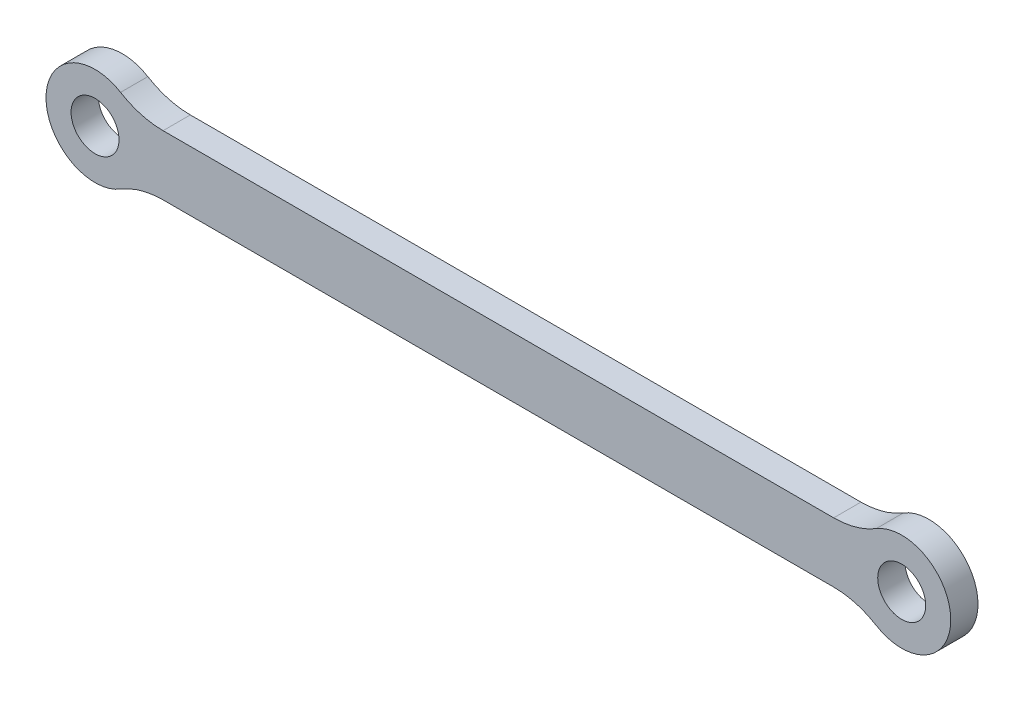
ISO-10303-21;
HEADER;
FILE_DESCRIPTION(('STEP AP214'),'2;1');
FILE_NAME('part.step','',(''),(''),'','','');
FILE_SCHEMA(('AUTOMOTIVE_DESIGN { 1 0 10303 214 1 1 1 1 }'));
ENDSEC;
DATA;
#1=APPLICATION_CONTEXT('core data for automotive mechanical design processes');
#2=APPLICATION_PROTOCOL_DEFINITION('international standard','automotive_design',2000,#1);
#3=PRODUCT_CONTEXT('',#1,'mechanical');
#4=PRODUCT('Part','Part','',(#3));
#5=PRODUCT_RELATED_PRODUCT_CATEGORY('part','',(#4));
#6=PRODUCT_DEFINITION_FORMATION('','',#4);
#7=PRODUCT_DEFINITION_CONTEXT('part definition',#1,'design');
#8=PRODUCT_DEFINITION('design','',#6,#7);
#9=PRODUCT_DEFINITION_SHAPE('','',#8);
#10=(LENGTH_UNIT() NAMED_UNIT(*) SI_UNIT(.MILLI.,.METRE.));
#11=(NAMED_UNIT(*) PLANE_ANGLE_UNIT() SI_UNIT($,.RADIAN.));
#12=(NAMED_UNIT(*) SI_UNIT($,.STERADIAN.) SOLID_ANGLE_UNIT());
#13=UNCERTAINTY_MEASURE_WITH_UNIT(LENGTH_MEASURE(1.E-05),#10,'distance_accuracy_value','');
#14=(GEOMETRIC_REPRESENTATION_CONTEXT(3) GLOBAL_UNCERTAINTY_ASSIGNED_CONTEXT((#13)) GLOBAL_UNIT_ASSIGNED_CONTEXT((#10,
#11,#12)) REPRESENTATION_CONTEXT('',''));
#15=CARTESIAN_POINT('',(0.,0.,0.));
#16=DIRECTION('',(0.,0.,1.));
#17=DIRECTION('',(1.,0.,0.));
#18=AXIS2_PLACEMENT_3D('',#15,#16,#17);
#19=CARTESIAN_POINT('',(-148.,0.,0.));
#20=DIRECTION('',(0.,0.,1.));
#21=DIRECTION('',(1.,0.,0.));
#22=AXIS2_PLACEMENT_3D('',#19,#20,#21);
#23=PLANE('',#22);
#24=CARTESIAN_POINT('',(0.,0.,0.));
#25=DIRECTION('',(0.,0.,-1.));
#26=DIRECTION('',(-1.,0.,0.));
#27=AXIS2_PLACEMENT_3D('',#24,#25,#26);
#28=CIRCLE('',#27,4.4);
#29=CARTESIAN_POINT('',(-4.4,0.,0.));
#30=VERTEX_POINT('',#29);
#31=EDGE_CURVE('E130',#30,#30,#28,.F.);
#32=ORIENTED_EDGE('',*,*,#31,.T.);
#33=EDGE_LOOP('',(#32));
#34=FACE_BOUND('',#33,.T.);
#35=CARTESIAN_POINT('',(-135.520016025651,20.5,0.));
#36=DIRECTION('',(0.,0.,-1.));
#37=DIRECTION('',(-1.,0.,0.));
#38=AXIS2_PLACEMENT_3D('',#35,#36,#37);
#39=CIRCLE('',#38,15.);
#40=CARTESIAN_POINT('',(-143.320006009619,7.68749999999998,0.));
#41=VERTEX_POINT('',#40);
#42=CARTESIAN_POINT('',(-135.520016025651,5.49999999999997,0.));
#43=VERTEX_POINT('',#42);
#44=EDGE_CURVE('E81',#41,#43,#39,.F.);
#45=ORIENTED_EDGE('',*,*,#44,.T.);
#46=DIRECTION('',(1.,0.,0.));
#47=VECTOR('',#46,1.);
#48=CARTESIAN_POINT('',(-140.876096575612,5.49999999999998,0.));
#49=LINE('',#48,#47);
#50=CARTESIAN_POINT('',(-12.4799839743487,5.49999999999998,0.));
#51=VERTEX_POINT('',#50);
#52=EDGE_CURVE('E84',#43,#51,#49,.T.);
#53=ORIENTED_EDGE('',*,*,#52,.T.);
#54=CARTESIAN_POINT('',(-12.4799839743487,20.5,0.));
#55=DIRECTION('',(0.,0.,-1.));
#56=DIRECTION('',(-1.,0.,0.));
#57=AXIS2_PLACEMENT_3D('',#54,#55,#56);
#58=CIRCLE('',#57,15.);
#59=CARTESIAN_POINT('',(-4.67999399038076,7.68749999999999,0.));
#60=VERTEX_POINT('',#59);
#61=EDGE_CURVE('E133',#51,#60,#58,.F.);
#62=ORIENTED_EDGE('',*,*,#61,.T.);
#63=CARTESIAN_POINT('',(0.,0.,0.));
#64=DIRECTION('',(0.,0.,-1.));
#65=DIRECTION('',(-1.,0.,0.));
#66=AXIS2_PLACEMENT_3D('',#63,#64,#65);
#67=CIRCLE('',#66,9.);
#68=CARTESIAN_POINT('',(-4.67999399038075,-7.68750000000001,0.));
#69=VERTEX_POINT('',#68);
#70=EDGE_CURVE('E135',#69,#60,#67,.F.);
#71=ORIENTED_EDGE('',*,*,#70,.F.);
#72=CARTESIAN_POINT('',(-12.4799839743487,-20.5,0.));
#73=DIRECTION('',(0.,0.,-1.));
#74=DIRECTION('',(-1.,0.,0.));
#75=AXIS2_PLACEMENT_3D('',#72,#73,#74);
#76=CIRCLE('',#75,15.);
#77=CARTESIAN_POINT('',(-12.4799839743487,-5.50000000000002,0.));
#78=VERTEX_POINT('',#77);
#79=EDGE_CURVE('E138',#69,#78,#76,.F.);
#80=ORIENTED_EDGE('',*,*,#79,.T.);
#81=DIRECTION('',(1.,0.,0.));
#82=VECTOR('',#81,1.);
#83=CARTESIAN_POINT('',(-140.876096575612,-5.50000000000002,0.));
#84=LINE('',#83,#82);
#85=CARTESIAN_POINT('',(-135.520016025651,-5.50000000000002,0.));
#86=VERTEX_POINT('',#85);
#87=EDGE_CURVE('E107',#78,#86,#84,.F.);
#88=ORIENTED_EDGE('',*,*,#87,.T.);
#89=CARTESIAN_POINT('',(-135.520016025651,-20.5,0.));
#90=DIRECTION('',(0.,0.,-1.));
#91=DIRECTION('',(-1.,0.,0.));
#92=AXIS2_PLACEMENT_3D('',#89,#90,#91);
#93=CIRCLE('',#92,15.);
#94=CARTESIAN_POINT('',(-143.320006009619,-7.68750000000003,0.));
#95=VERTEX_POINT('',#94);
#96=EDGE_CURVE('E141',#86,#95,#93,.F.);
#97=ORIENTED_EDGE('',*,*,#96,.T.);
#98=CARTESIAN_POINT('',(-148.,0.,0.));
#99=DIRECTION('',(0.,0.,-1.));
#100=DIRECTION('',(-1.,0.,0.));
#101=AXIS2_PLACEMENT_3D('',#98,#99,#100);
#102=CIRCLE('',#101,9.00000000000001);
#103=EDGE_CURVE('E79',#41,#95,#102,.F.);
#104=ORIENTED_EDGE('',*,*,#103,.F.);
#105=EDGE_LOOP('',(#45,#53,#62,#71,#80,#88,#97,#104));
#106=FACE_BOUND('',#105,.T.);
#107=CARTESIAN_POINT('',(-148.,0.,0.));
#108=DIRECTION('',(0.,0.,-1.));
#109=DIRECTION('',(-1.,0.,0.));
#110=AXIS2_PLACEMENT_3D('',#107,#108,#109);
#111=CIRCLE('',#110,4.39999999999999);
#112=CARTESIAN_POINT('',(-152.4,0.,0.));
#113=VERTEX_POINT('',#112);
#114=EDGE_CURVE('E20',#113,#113,#111,.F.);
#115=ORIENTED_EDGE('',*,*,#114,.T.);
#116=EDGE_LOOP('',(#115));
#117=FACE_BOUND('',#116,.T.);
#118=ADVANCED_FACE('F17',(#34,#106,#117),#23,.F.);
#119=CARTESIAN_POINT('',(-148.,0.,5.));
#120=DIRECTION('',(0.,0.,-1.));
#121=DIRECTION('',(-1.,0.,0.));
#122=AXIS2_PLACEMENT_3D('',#119,#120,#121);
#123=CYLINDRICAL_SURFACE('',#122,4.39999999999999);
#124=CARTESIAN_POINT('',(-148.,0.,5.));
#125=DIRECTION('',(0.,0.,-1.));
#126=DIRECTION('',(-1.,0.,0.));
#127=AXIS2_PLACEMENT_3D('',#124,#125,#126);
#128=CIRCLE('',#127,4.39999999999999);
#129=CARTESIAN_POINT('',(-152.4,0.,5.));
#130=VERTEX_POINT('',#129);
#131=EDGE_CURVE('E127',#130,#130,#128,.T.);
#132=ORIENTED_EDGE('',*,*,#131,.F.);
#133=EDGE_LOOP('',(#132));
#134=FACE_BOUND('',#133,.T.);
#135=ORIENTED_EDGE('',*,*,#114,.F.);
#136=EDGE_LOOP('',(#135));
#137=FACE_BOUND('',#136,.T.);
#138=ADVANCED_FACE('F198',(#134,#137),#123,.F.);
#139=CARTESIAN_POINT('',(-140.876096575612,5.49999999999998,5.));
#140=DIRECTION('',(0.,-1.,0.));
#141=DIRECTION('',(0.,0.,-1.));
#142=AXIS2_PLACEMENT_3D('',#139,#140,#141);
#143=PLANE('',#142);
#144=DIRECTION('',(0.,0.,-1.));
#145=VECTOR('',#144,1.);
#146=CARTESIAN_POINT('',(-135.520016025651,5.49999999999997,5.));
#147=LINE('',#146,#145);
#148=CARTESIAN_POINT('',(-135.520016025651,5.49999999999997,5.));
#149=VERTEX_POINT('',#148);
#150=EDGE_CURVE('E89',#43,#149,#147,.F.);
#151=ORIENTED_EDGE('',*,*,#150,.T.);
#152=DIRECTION('',(1.,0.,0.));
#153=VECTOR('',#152,1.);
#154=CARTESIAN_POINT('',(-148.,5.49999999999998,5.));
#155=LINE('',#154,#153);
#156=CARTESIAN_POINT('',(-12.4799839743487,5.49999999999998,5.));
#157=VERTEX_POINT('',#156);
#158=EDGE_CURVE('E126',#157,#149,#155,.F.);
#159=ORIENTED_EDGE('',*,*,#158,.F.);
#160=DIRECTION('',(0.,0.,-1.));
#161=VECTOR('',#160,1.);
#162=CARTESIAN_POINT('',(-12.4799839743487,5.49999999999998,5.));
#163=LINE('',#162,#161);
#164=EDGE_CURVE('E95',#157,#51,#163,.T.);
#165=ORIENTED_EDGE('',*,*,#164,.T.);
#166=ORIENTED_EDGE('',*,*,#52,.F.);
#167=EDGE_LOOP('',(#151,#159,#165,#166));
#168=FACE_BOUND('',#167,.T.);
#169=ADVANCED_FACE('F91',(#168),#143,.F.);
#170=CARTESIAN_POINT('',(-135.520016025651,20.5,5.));
#171=DIRECTION('',(0.,0.,-1.));
#172=DIRECTION('',(-1.,0.,0.));
#173=AXIS2_PLACEMENT_3D('',#170,#171,#172);
#174=CYLINDRICAL_SURFACE('',#173,15.);
#175=ORIENTED_EDGE('',*,*,#150,.F.);
#176=ORIENTED_EDGE('',*,*,#44,.F.);
#177=DIRECTION('',(0.,0.,-1.));
#178=VECTOR('',#177,1.);
#179=CARTESIAN_POINT('',(-143.320006009619,7.68749999999998,5.));
#180=LINE('',#179,#178);
#181=CARTESIAN_POINT('',(-143.320006009619,7.68749999999998,5.));
#182=VERTEX_POINT('',#181);
#183=EDGE_CURVE('E102',#182,#41,#180,.T.);
#184=ORIENTED_EDGE('',*,*,#183,.F.);
#185=CARTESIAN_POINT('',(-135.520016025651,20.5,5.));
#186=DIRECTION('',(0.,0.,-1.));
#187=DIRECTION('',(-1.,0.,0.));
#188=AXIS2_PLACEMENT_3D('',#185,#186,#187);
#189=CIRCLE('',#188,15.);
#190=EDGE_CURVE('E100',#149,#182,#189,.T.);
#191=ORIENTED_EDGE('',*,*,#190,.F.);
#192=EDGE_LOOP('',(#175,#176,#184,#191));
#193=FACE_BOUND('',#192,.T.);
#194=ADVANCED_FACE('F98',(#193),#174,.F.);
#195=CARTESIAN_POINT('',(-148.,0.,5.));
#196=DIRECTION('',(0.,0.,-1.));
#197=DIRECTION('',(-1.,0.,0.));
#198=AXIS2_PLACEMENT_3D('',#195,#196,#197);
#199=CYLINDRICAL_SURFACE('',#198,9.00000000000001);
#200=ORIENTED_EDGE('',*,*,#103,.T.);
#201=DIRECTION('',(0.,0.,-1.));
#202=VECTOR('',#201,1.);
#203=CARTESIAN_POINT('',(-143.320006009619,-7.68750000000003,5.));
#204=LINE('',#203,#202);
#205=CARTESIAN_POINT('',(-143.320006009619,-7.68750000000003,5.));
#206=VERTEX_POINT('',#205);
#207=EDGE_CURVE('E109',#95,#206,#204,.F.);
#208=ORIENTED_EDGE('',*,*,#207,.T.);
#209=CARTESIAN_POINT('',(-148.,0.,5.));
#210=DIRECTION('',(0.,0.,-1.));
#211=DIRECTION('',(-1.,0.,0.));
#212=AXIS2_PLACEMENT_3D('',#209,#210,#211);
#213=CIRCLE('',#212,9.00000000000001);
#214=EDGE_CURVE('E123',#182,#206,#213,.F.);
#215=ORIENTED_EDGE('',*,*,#214,.F.);
#216=ORIENTED_EDGE('',*,*,#183,.T.);
#217=EDGE_LOOP('',(#200,#208,#215,#216));
#218=FACE_BOUND('',#217,.T.);
#219=ADVANCED_FACE('F146',(#218),#199,.T.);
#220=CARTESIAN_POINT('',(-135.520016025651,-20.5,5.));
#221=DIRECTION('',(0.,0.,-1.));
#222=DIRECTION('',(-1.,0.,0.));
#223=AXIS2_PLACEMENT_3D('',#220,#221,#222);
#224=CYLINDRICAL_SURFACE('',#223,15.);
#225=ORIENTED_EDGE('',*,*,#207,.F.);
#226=ORIENTED_EDGE('',*,*,#96,.F.);
#227=DIRECTION('',(0.,0.,1.));
#228=VECTOR('',#227,1.);
#229=CARTESIAN_POINT('',(-135.520016025651,-5.50000000000002,5.));
#230=LINE('',#229,#228);
#231=CARTESIAN_POINT('',(-135.520016025651,-5.50000000000002,5.));
#232=VERTEX_POINT('',#231);
#233=EDGE_CURVE('E108',#86,#232,#230,.T.);
#234=ORIENTED_EDGE('',*,*,#233,.T.);
#235=CARTESIAN_POINT('',(-135.520016025651,-20.5,5.));
#236=DIRECTION('',(0.,0.,-1.));
#237=DIRECTION('',(-1.,0.,0.));
#238=AXIS2_PLACEMENT_3D('',#235,#236,#237);
#239=CIRCLE('',#238,15.);
#240=EDGE_CURVE('E120',#206,#232,#239,.T.);
#241=ORIENTED_EDGE('',*,*,#240,.F.);
#242=EDGE_LOOP('',(#225,#226,#234,#241));
#243=FACE_BOUND('',#242,.T.);
#244=ADVANCED_FACE('F151',(#243),#224,.F.);
#245=CARTESIAN_POINT('',(-140.876096575612,-5.50000000000002,5.));
#246=DIRECTION('',(0.,1.,0.));
#247=DIRECTION('',(0.,0.,1.));
#248=AXIS2_PLACEMENT_3D('',#245,#246,#247);
#249=PLANE('',#248);
#250=ORIENTED_EDGE('',*,*,#233,.F.);
#251=ORIENTED_EDGE('',*,*,#87,.F.);
#252=DIRECTION('',(0.,0.,-1.));
#253=VECTOR('',#252,1.);
#254=CARTESIAN_POINT('',(-12.4799839743487,-5.50000000000002,5.));
#255=LINE('',#254,#253);
#256=CARTESIAN_POINT('',(-12.4799839743487,-5.50000000000002,5.));
#257=VERTEX_POINT('',#256);
#258=EDGE_CURVE('E140',#78,#257,#255,.F.);
#259=ORIENTED_EDGE('',*,*,#258,.T.);
#260=DIRECTION('',(1.,0.,0.));
#261=VECTOR('',#260,1.);
#262=CARTESIAN_POINT('',(-148.,-5.50000000000002,5.));
#263=LINE('',#262,#261);
#264=EDGE_CURVE('E119',#232,#257,#263,.T.);
#265=ORIENTED_EDGE('',*,*,#264,.F.);
#266=EDGE_LOOP('',(#250,#251,#259,#265));
#267=FACE_BOUND('',#266,.T.);
#268=ADVANCED_FACE('F168',(#267),#249,.F.);
#269=CARTESIAN_POINT('',(-12.4799839743487,-20.5,5.));
#270=DIRECTION('',(0.,0.,-1.));
#271=DIRECTION('',(-1.,0.,0.));
#272=AXIS2_PLACEMENT_3D('',#269,#270,#271);
#273=CYLINDRICAL_SURFACE('',#272,15.);
#274=ORIENTED_EDGE('',*,*,#258,.F.);
#275=ORIENTED_EDGE('',*,*,#79,.F.);
#276=DIRECTION('',(0.,0.,-1.));
#277=VECTOR('',#276,1.);
#278=CARTESIAN_POINT('',(-4.67999399038075,-7.68750000000001,5.));
#279=LINE('',#278,#277);
#280=CARTESIAN_POINT('',(-4.67999399038075,-7.68750000000001,5.));
#281=VERTEX_POINT('',#280);
#282=EDGE_CURVE('E137',#281,#69,#279,.T.);
#283=ORIENTED_EDGE('',*,*,#282,.F.);
#284=CARTESIAN_POINT('',(-12.4799839743487,-20.5,5.));
#285=DIRECTION('',(0.,0.,-1.));
#286=DIRECTION('',(-1.,0.,0.));
#287=AXIS2_PLACEMENT_3D('',#284,#285,#286);
#288=CIRCLE('',#287,15.);
#289=EDGE_CURVE('E116',#257,#281,#288,.T.);
#290=ORIENTED_EDGE('',*,*,#289,.F.);
#291=EDGE_LOOP('',(#274,#275,#283,#290));
#292=FACE_BOUND('',#291,.T.);
#293=ADVANCED_FACE('F172',(#292),#273,.F.);
#294=CARTESIAN_POINT('',(0.,0.,5.));
#295=DIRECTION('',(0.,0.,-1.));
#296=DIRECTION('',(-1.,0.,0.));
#297=AXIS2_PLACEMENT_3D('',#294,#295,#296);
#298=CYLINDRICAL_SURFACE('',#297,9.);
#299=ORIENTED_EDGE('',*,*,#70,.T.);
#300=DIRECTION('',(0.,0.,-1.));
#301=VECTOR('',#300,1.);
#302=CARTESIAN_POINT('',(-4.67999399038076,7.6875,5.));
#303=LINE('',#302,#301);
#304=CARTESIAN_POINT('',(-4.67999399038076,7.68749999999999,5.));
#305=VERTEX_POINT('',#304);
#306=EDGE_CURVE('E35',#60,#305,#303,.F.);
#307=ORIENTED_EDGE('',*,*,#306,.T.);
#308=CARTESIAN_POINT('',(0.,0.,5.));
#309=DIRECTION('',(0.,0.,-1.));
#310=DIRECTION('',(-1.,0.,0.));
#311=AXIS2_PLACEMENT_3D('',#308,#309,#310);
#312=CIRCLE('',#311,9.);
#313=EDGE_CURVE('E113',#281,#305,#312,.F.);
#314=ORIENTED_EDGE('',*,*,#313,.F.);
#315=ORIENTED_EDGE('',*,*,#282,.T.);
#316=EDGE_LOOP('',(#299,#307,#314,#315));
#317=FACE_BOUND('',#316,.T.);
#318=ADVANCED_FACE('F174',(#317),#298,.T.);
#319=CARTESIAN_POINT('',(-12.4799839743487,20.5,5.));
#320=DIRECTION('',(0.,0.,-1.));
#321=DIRECTION('',(-1.,0.,0.));
#322=AXIS2_PLACEMENT_3D('',#319,#320,#321);
#323=CYLINDRICAL_SURFACE('',#322,15.);
#324=ORIENTED_EDGE('',*,*,#306,.F.);
#325=ORIENTED_EDGE('',*,*,#61,.F.);
#326=ORIENTED_EDGE('',*,*,#164,.F.);
#327=CARTESIAN_POINT('',(-12.4799839743487,20.5,5.));
#328=DIRECTION('',(0.,0.,-1.));
#329=DIRECTION('',(-1.,0.,0.));
#330=AXIS2_PLACEMENT_3D('',#327,#328,#329);
#331=CIRCLE('',#330,15.);
#332=EDGE_CURVE('E26',#305,#157,#331,.T.);
#333=ORIENTED_EDGE('',*,*,#332,.F.);
#334=EDGE_LOOP('',(#324,#325,#326,#333));
#335=FACE_BOUND('',#334,.T.);
#336=ADVANCED_FACE('F176',(#335),#323,.F.);
#337=CARTESIAN_POINT('',(0.,0.,5.));
#338=DIRECTION('',(0.,0.,-1.));
#339=DIRECTION('',(-1.,0.,0.));
#340=AXIS2_PLACEMENT_3D('',#337,#338,#339);
#341=CYLINDRICAL_SURFACE('',#340,4.4);
#342=CARTESIAN_POINT('',(0.,0.,5.));
#343=DIRECTION('',(0.,0.,-1.));
#344=DIRECTION('',(-1.,0.,0.));
#345=AXIS2_PLACEMENT_3D('',#342,#343,#344);
#346=CIRCLE('',#345,4.4);
#347=CARTESIAN_POINT('',(-4.4,0.,5.));
#348=VERTEX_POINT('',#347);
#349=EDGE_CURVE('E11',#348,#348,#346,.T.);
#350=ORIENTED_EDGE('',*,*,#349,.F.);
#351=EDGE_LOOP('',(#350));
#352=FACE_BOUND('',#351,.T.);
#353=ORIENTED_EDGE('',*,*,#31,.F.);
#354=EDGE_LOOP('',(#353));
#355=FACE_BOUND('',#354,.T.);
#356=ADVANCED_FACE('F178',(#352,#355),#341,.F.);
#357=CARTESIAN_POINT('',(-148.,0.,5.));
#358=DIRECTION('',(0.,0.,1.));
#359=DIRECTION('',(1.,0.,0.));
#360=AXIS2_PLACEMENT_3D('',#357,#358,#359);
#361=PLANE('',#360);
#362=ORIENTED_EDGE('',*,*,#349,.T.);
#363=EDGE_LOOP('',(#362));
#364=FACE_BOUND('',#363,.T.);
#365=ORIENTED_EDGE('',*,*,#313,.T.);
#366=ORIENTED_EDGE('',*,*,#332,.T.);
#367=ORIENTED_EDGE('',*,*,#158,.T.);
#368=ORIENTED_EDGE('',*,*,#190,.T.);
#369=ORIENTED_EDGE('',*,*,#214,.T.);
#370=ORIENTED_EDGE('',*,*,#240,.T.);
#371=ORIENTED_EDGE('',*,*,#264,.T.);
#372=ORIENTED_EDGE('',*,*,#289,.T.);
#373=EDGE_LOOP('',(#365,#366,#367,#368,#369,#370,#371,#372));
#374=FACE_BOUND('',#373,.T.);
#375=ORIENTED_EDGE('',*,*,#131,.T.);
#376=EDGE_LOOP('',(#375));
#377=FACE_BOUND('',#376,.T.);
#378=ADVANCED_FACE('F164',(#364,#374,#377),#361,.T.);
#379=CLOSED_SHELL('',(#118,#138,#169,#194,#219,#244,#268,#293,#318,#336,#356,#378));
#380=MANIFOLD_SOLID_BREP('B1',#379);
#381=ADVANCED_BREP_SHAPE_REPRESENTATION('',(#18,#380),#14);
#382=SHAPE_DEFINITION_REPRESENTATION(#9,#381);
ENDSEC;
END-ISO-10303-21;
